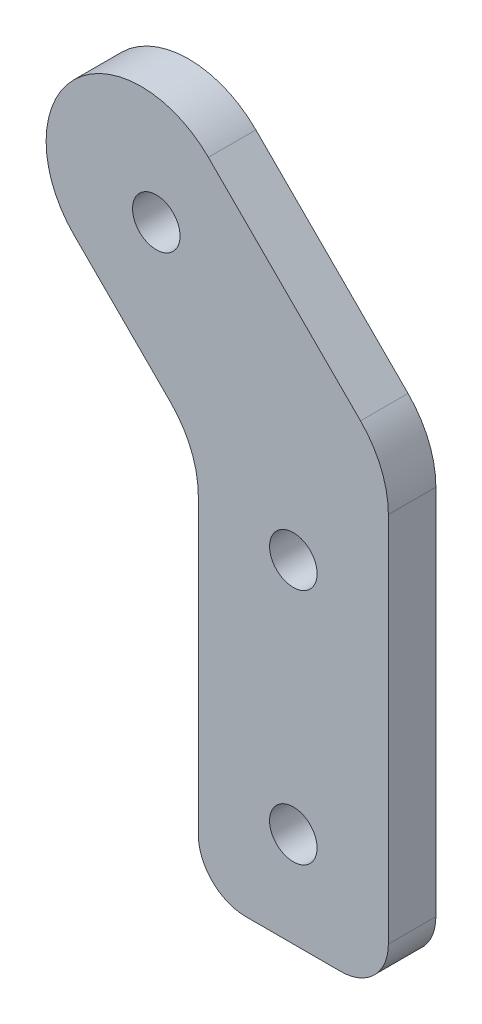
ISO-10303-21;
HEADER;
FILE_DESCRIPTION(('STEP AP214'),'2;1');
FILE_NAME('part.step','',(''),(''),'','','');
FILE_SCHEMA(('AUTOMOTIVE_DESIGN { 1 0 10303 214 1 1 1 1 }'));
ENDSEC;
DATA;
#1=APPLICATION_CONTEXT('core data for automotive mechanical design processes');
#2=APPLICATION_PROTOCOL_DEFINITION('international standard','automotive_design',2000,#1);
#3=PRODUCT_CONTEXT('',#1,'mechanical');
#4=PRODUCT('Part','Part','',(#3));
#5=PRODUCT_RELATED_PRODUCT_CATEGORY('part','',(#4));
#6=PRODUCT_DEFINITION_FORMATION('','',#4);
#7=PRODUCT_DEFINITION_CONTEXT('part definition',#1,'design');
#8=PRODUCT_DEFINITION('design','',#6,#7);
#9=PRODUCT_DEFINITION_SHAPE('','',#8);
#10=(LENGTH_UNIT() NAMED_UNIT(*) SI_UNIT(.MILLI.,.METRE.));
#11=(NAMED_UNIT(*) PLANE_ANGLE_UNIT() SI_UNIT($,.RADIAN.));
#12=(NAMED_UNIT(*) SI_UNIT($,.STERADIAN.) SOLID_ANGLE_UNIT());
#13=UNCERTAINTY_MEASURE_WITH_UNIT(LENGTH_MEASURE(1.E-05),#10,'distance_accuracy_value','');
#14=(GEOMETRIC_REPRESENTATION_CONTEXT(3) GLOBAL_UNCERTAINTY_ASSIGNED_CONTEXT((#13)) GLOBAL_UNIT_ASSIGNED_CONTEXT((#10,
#11,#12)) REPRESENTATION_CONTEXT('',''));
#15=CARTESIAN_POINT('',(0.,0.,0.));
#16=DIRECTION('',(0.,0.,1.));
#17=DIRECTION('',(1.,0.,0.));
#18=AXIS2_PLACEMENT_3D('',#15,#16,#17);
#19=CARTESIAN_POINT('',(0.,0.,5.));
#20=DIRECTION('',(0.,0.,-1.));
#21=DIRECTION('',(-1.,0.,0.));
#22=AXIS2_PLACEMENT_3D('',#19,#20,#21);
#23=PLANE('',#22);
#24=DIRECTION('',(1.,0.,0.));
#25=VECTOR('',#24,1.);
#26=CARTESIAN_POINT('',(20.,0.,5.));
#27=LINE('',#26,#25);
#28=CARTESIAN_POINT('',(5.,0.,5.));
#29=VERTEX_POINT('',#28);
#30=CARTESIAN_POINT('',(15.,0.,5.));
#31=VERTEX_POINT('',#30);
#32=EDGE_CURVE('E169',#29,#31,#27,.T.);
#33=ORIENTED_EDGE('',*,*,#32,.T.);
#34=CARTESIAN_POINT('',(15.,5.,5.));
#35=DIRECTION('',(0.,0.,-1.));
#36=DIRECTION('',(-1.,0.,0.));
#37=AXIS2_PLACEMENT_3D('',#34,#35,#36);
#38=CIRCLE('',#37,5.);
#39=CARTESIAN_POINT('',(20.,5.,5.));
#40=VERTEX_POINT('',#39);
#41=EDGE_CURVE('E48',#31,#40,#38,.F.);
#42=ORIENTED_EDGE('',*,*,#41,.T.);
#43=DIRECTION('',(0.,1.,0.));
#44=VECTOR('',#43,1.);
#45=CARTESIAN_POINT('',(20.,48.2842712474619,5.));
#46=LINE('',#45,#44);
#47=CARTESIAN_POINT('',(20.,44.1421356237309,5.));
#48=VERTEX_POINT('',#47);
#49=EDGE_CURVE('E233',#40,#48,#46,.T.);
#50=ORIENTED_EDGE('',*,*,#49,.T.);
#51=CARTESIAN_POINT('',(10.,44.1421356237309,5.));
#52=DIRECTION('',(0.,0.,-1.));
#53=DIRECTION('',(-1.,0.,0.));
#54=AXIS2_PLACEMENT_3D('',#51,#52,#53);
#55=CIRCLE('',#54,10.);
#56=CARTESIAN_POINT('',(17.0710678118655,51.2132034355964,5.));
#57=VERTEX_POINT('',#56);
#58=EDGE_CURVE('E185',#48,#57,#55,.F.);
#59=ORIENTED_EDGE('',*,*,#58,.T.);
#60=DIRECTION('',(-0.707106781186546,0.707106781186549,0.));
#61=VECTOR('',#60,1.);
#62=CARTESIAN_POINT('',(-6.01080477724779,74.2950760247098,5.));
#63=LINE('',#62,#61);
#64=CARTESIAN_POINT('',(1.06026303461767,67.2240082128443,5.));
#65=VERTEX_POINT('',#64);
#66=EDGE_CURVE('E146',#57,#65,#63,.T.);
#67=ORIENTED_EDGE('',*,*,#66,.T.);
#68=CARTESIAN_POINT('',(-6.01080477724782,60.1529404009788,5.));
#69=DIRECTION('',(0.,0.,-1.));
#70=DIRECTION('',(-1.,0.,0.));
#71=AXIS2_PLACEMENT_3D('',#68,#69,#70);
#72=CIRCLE('',#71,10.);
#73=CARTESIAN_POINT('',(-13.0818725891133,67.2240082128443,5.));
#74=VERTEX_POINT('',#73);
#75=EDGE_CURVE('E179',#65,#74,#72,.F.);
#76=ORIENTED_EDGE('',*,*,#75,.T.);
#77=CARTESIAN_POINT('',(-6.01080477724782,60.1529404009788,5.));
#78=DIRECTION('',(0.,0.,-1.));
#79=DIRECTION('',(-1.,0.,0.));
#80=AXIS2_PLACEMENT_3D('',#77,#78,#79);
#81=CIRCLE('',#80,10.);
#82=CARTESIAN_POINT('',(-13.0818725891133,53.0818725891134,5.));
#83=VERTEX_POINT('',#82);
#84=EDGE_CURVE('E182',#74,#83,#81,.F.);
#85=ORIENTED_EDGE('',*,*,#84,.T.);
#86=DIRECTION('',(0.707106781186546,-0.707106781186549,0.));
#87=VECTOR('',#86,1.);
#88=CARTESIAN_POINT('',(0.,40.,5.));
#89=LINE('',#88,#87);
#90=CARTESIAN_POINT('',(-2.92893218813451,42.9289321881345,5.));
#91=VERTEX_POINT('',#90);
#92=EDGE_CURVE('E253',#83,#91,#89,.T.);
#93=ORIENTED_EDGE('',*,*,#92,.T.);
#94=CARTESIAN_POINT('',(-10.,35.8578643762691,5.));
#95=DIRECTION('',(0.,0.,-1.));
#96=DIRECTION('',(-1.,0.,0.));
#97=AXIS2_PLACEMENT_3D('',#94,#95,#96);
#98=CIRCLE('',#97,10.);
#99=CARTESIAN_POINT('',(0.,35.8578643762691,5.));
#100=VERTEX_POINT('',#99);
#101=EDGE_CURVE('E202',#91,#100,#98,.T.);
#102=ORIENTED_EDGE('',*,*,#101,.T.);
#103=DIRECTION('',(0.,-1.,0.));
#104=VECTOR('',#103,1.);
#105=CARTESIAN_POINT('',(0.,0.,5.));
#106=LINE('',#105,#104);
#107=CARTESIAN_POINT('',(0.,5.,5.));
#108=VERTEX_POINT('',#107);
#109=EDGE_CURVE('E171',#100,#108,#106,.T.);
#110=ORIENTED_EDGE('',*,*,#109,.T.);
#111=CARTESIAN_POINT('',(5.,5.,5.));
#112=DIRECTION('',(0.,0.,-1.));
#113=DIRECTION('',(-1.,0.,0.));
#114=AXIS2_PLACEMENT_3D('',#111,#112,#113);
#115=CIRCLE('',#114,5.);
#116=EDGE_CURVE('E226',#108,#29,#115,.F.);
#117=ORIENTED_EDGE('',*,*,#116,.T.);
#118=EDGE_LOOP('',(#33,#42,#50,#59,#67,#76,#85,#93,#102,#110,#117));
#119=FACE_BOUND('',#118,.T.);
#120=CARTESIAN_POINT('',(10.,10.,5.));
#121=DIRECTION('',(0.,0.,1.));
#122=DIRECTION('',(1.,0.,0.));
#123=AXIS2_PLACEMENT_3D('',#120,#121,#122);
#124=CIRCLE('',#123,2.5);
#125=CARTESIAN_POINT('',(12.5,10.,5.));
#126=VERTEX_POINT('',#125);
#127=EDGE_CURVE('E245',#126,#126,#124,.T.);
#128=ORIENTED_EDGE('',*,*,#127,.F.);
#129=EDGE_LOOP('',(#128));
#130=FACE_BOUND('',#129,.T.);
#131=CARTESIAN_POINT('',(9.99999999999999,35.,5.));
#132=DIRECTION('',(0.,0.,1.));
#133=DIRECTION('',(1.,0.,0.));
#134=AXIS2_PLACEMENT_3D('',#131,#132,#133);
#135=CIRCLE('',#134,2.5);
#136=CARTESIAN_POINT('',(12.5,35.,5.));
#137=VERTEX_POINT('',#136);
#138=EDGE_CURVE('E263',#137,#137,#135,.T.);
#139=ORIENTED_EDGE('',*,*,#138,.F.);
#140=EDGE_LOOP('',(#139));
#141=FACE_BOUND('',#140,.T.);
#142=CARTESIAN_POINT('',(-4.41957066525225,58.5617062889833,5.));
#143=DIRECTION('',(0.,0.,1.));
#144=DIRECTION('',(1.,0.,0.));
#145=AXIS2_PLACEMENT_3D('',#142,#143,#144);
#146=CIRCLE('',#145,2.5);
#147=CARTESIAN_POINT('',(-1.91957066525225,58.5617062889833,5.));
#148=VERTEX_POINT('',#147);
#149=EDGE_CURVE('E269',#148,#148,#146,.T.);
#150=ORIENTED_EDGE('',*,*,#149,.F.);
#151=EDGE_LOOP('',(#150));
#152=FACE_BOUND('',#151,.T.);
#153=ADVANCED_FACE('F39',(#119,#130,#141,#152),#23,.F.);
#154=CARTESIAN_POINT('',(0.,0.,0.));
#155=DIRECTION('',(0.,0.,-1.));
#156=DIRECTION('',(-1.,0.,0.));
#157=AXIS2_PLACEMENT_3D('',#154,#155,#156);
#158=PLANE('',#157);
#159=CARTESIAN_POINT('',(9.99999999999999,35.,0.));
#160=DIRECTION('',(0.,0.,1.));
#161=DIRECTION('',(1.,0.,0.));
#162=AXIS2_PLACEMENT_3D('',#159,#160,#161);
#163=CIRCLE('',#162,2.5);
#164=CARTESIAN_POINT('',(12.5,35.,0.));
#165=VERTEX_POINT('',#164);
#166=EDGE_CURVE('E265',#165,#165,#163,.T.);
#167=ORIENTED_EDGE('',*,*,#166,.T.);
#168=EDGE_LOOP('',(#167));
#169=FACE_BOUND('',#168,.T.);
#170=DIRECTION('',(0.,1.,0.));
#171=VECTOR('',#170,1.);
#172=CARTESIAN_POINT('',(20.,48.2842712474619,0.));
#173=LINE('',#172,#171);
#174=CARTESIAN_POINT('',(20.,5.,0.));
#175=VERTEX_POINT('',#174);
#176=CARTESIAN_POINT('',(20.,44.1421356237309,0.));
#177=VERTEX_POINT('',#176);
#178=EDGE_CURVE('E156',#175,#177,#173,.T.);
#179=ORIENTED_EDGE('',*,*,#178,.F.);
#180=CARTESIAN_POINT('',(15.,5.,0.));
#181=DIRECTION('',(0.,0.,-1.));
#182=DIRECTION('',(-1.,0.,0.));
#183=AXIS2_PLACEMENT_3D('',#180,#181,#182);
#184=CIRCLE('',#183,5.);
#185=CARTESIAN_POINT('',(15.,0.,0.));
#186=VERTEX_POINT('',#185);
#187=EDGE_CURVE('E217',#175,#186,#184,.T.);
#188=ORIENTED_EDGE('',*,*,#187,.T.);
#189=DIRECTION('',(1.,0.,0.));
#190=VECTOR('',#189,1.);
#191=CARTESIAN_POINT('',(20.,0.,0.));
#192=LINE('',#191,#190);
#193=CARTESIAN_POINT('',(5.,0.,0.));
#194=VERTEX_POINT('',#193);
#195=EDGE_CURVE('E163',#194,#186,#192,.T.);
#196=ORIENTED_EDGE('',*,*,#195,.F.);
#197=CARTESIAN_POINT('',(5.,5.,0.));
#198=DIRECTION('',(0.,0.,-1.));
#199=DIRECTION('',(-1.,0.,0.));
#200=AXIS2_PLACEMENT_3D('',#197,#198,#199);
#201=CIRCLE('',#200,5.);
#202=CARTESIAN_POINT('',(0.,5.,0.));
#203=VERTEX_POINT('',#202);
#204=EDGE_CURVE('E214',#194,#203,#201,.T.);
#205=ORIENTED_EDGE('',*,*,#204,.T.);
#206=DIRECTION('',(0.,-1.,0.));
#207=VECTOR('',#206,1.);
#208=CARTESIAN_POINT('',(0.,0.,0.));
#209=LINE('',#208,#207);
#210=CARTESIAN_POINT('',(0.,35.8578643762691,0.));
#211=VERTEX_POINT('',#210);
#212=EDGE_CURVE('E161',#211,#203,#209,.T.);
#213=ORIENTED_EDGE('',*,*,#212,.F.);
#214=CARTESIAN_POINT('',(-10.,35.8578643762691,0.));
#215=DIRECTION('',(0.,0.,-1.));
#216=DIRECTION('',(-1.,0.,0.));
#217=AXIS2_PLACEMENT_3D('',#214,#215,#216);
#218=CIRCLE('',#217,10.);
#219=CARTESIAN_POINT('',(-2.92893218813451,42.9289321881345,0.));
#220=VERTEX_POINT('',#219);
#221=EDGE_CURVE('E199',#211,#220,#218,.F.);
#222=ORIENTED_EDGE('',*,*,#221,.T.);
#223=DIRECTION('',(0.707106781186546,-0.707106781186549,0.));
#224=VECTOR('',#223,1.);
#225=CARTESIAN_POINT('',(0.,40.,0.));
#226=LINE('',#225,#224);
#227=CARTESIAN_POINT('',(-13.0818725891133,53.0818725891134,0.));
#228=VERTEX_POINT('',#227);
#229=EDGE_CURVE('E155',#228,#220,#226,.T.);
#230=ORIENTED_EDGE('',*,*,#229,.F.);
#231=CARTESIAN_POINT('',(-6.01080477724782,60.1529404009788,0.));
#232=DIRECTION('',(0.,0.,-1.));
#233=DIRECTION('',(-1.,0.,0.));
#234=AXIS2_PLACEMENT_3D('',#231,#232,#233);
#235=CIRCLE('',#234,10.);
#236=CARTESIAN_POINT('',(-13.0818725891133,67.2240082128443,0.));
#237=VERTEX_POINT('',#236);
#238=EDGE_CURVE('E137',#228,#237,#235,.T.);
#239=ORIENTED_EDGE('',*,*,#238,.T.);
#240=CARTESIAN_POINT('',(-6.01080477724782,60.1529404009788,0.));
#241=DIRECTION('',(0.,0.,-1.));
#242=DIRECTION('',(-1.,0.,0.));
#243=AXIS2_PLACEMENT_3D('',#240,#241,#242);
#244=CIRCLE('',#243,10.);
#245=CARTESIAN_POINT('',(1.06026303461767,67.2240082128443,0.));
#246=VERTEX_POINT('',#245);
#247=EDGE_CURVE('E148',#237,#246,#244,.T.);
#248=ORIENTED_EDGE('',*,*,#247,.T.);
#249=DIRECTION('',(-0.707106781186546,0.707106781186549,0.));
#250=VECTOR('',#249,1.);
#251=CARTESIAN_POINT('',(-6.01080477724779,74.2950760247098,0.));
#252=LINE('',#251,#250);
#253=CARTESIAN_POINT('',(17.0710678118655,51.2132034355964,0.));
#254=VERTEX_POINT('',#253);
#255=EDGE_CURVE('E143',#254,#246,#252,.T.);
#256=ORIENTED_EDGE('',*,*,#255,.F.);
#257=CARTESIAN_POINT('',(10.,44.1421356237309,0.));
#258=DIRECTION('',(0.,0.,-1.));
#259=DIRECTION('',(-1.,0.,0.));
#260=AXIS2_PLACEMENT_3D('',#257,#258,#259);
#261=CIRCLE('',#260,10.);
#262=EDGE_CURVE('E126',#254,#177,#261,.T.);
#263=ORIENTED_EDGE('',*,*,#262,.T.);
#264=EDGE_LOOP('',(#179,#188,#196,#205,#213,#222,#230,#239,#248,#256,#263));
#265=FACE_BOUND('',#264,.T.);
#266=CARTESIAN_POINT('',(10.,10.,0.));
#267=DIRECTION('',(0.,0.,1.));
#268=DIRECTION('',(1.,0.,0.));
#269=AXIS2_PLACEMENT_3D('',#266,#267,#268);
#270=CIRCLE('',#269,2.5);
#271=CARTESIAN_POINT('',(12.5,10.,0.));
#272=VERTEX_POINT('',#271);
#273=EDGE_CURVE('E248',#272,#272,#270,.T.);
#274=ORIENTED_EDGE('',*,*,#273,.T.);
#275=EDGE_LOOP('',(#274));
#276=FACE_BOUND('',#275,.T.);
#277=CARTESIAN_POINT('',(-4.41957066525225,58.5617062889833,0.));
#278=DIRECTION('',(0.,0.,1.));
#279=DIRECTION('',(1.,0.,0.));
#280=AXIS2_PLACEMENT_3D('',#277,#278,#279);
#281=CIRCLE('',#280,2.5);
#282=CARTESIAN_POINT('',(-1.91957066525225,58.5617062889833,0.));
#283=VERTEX_POINT('',#282);
#284=EDGE_CURVE('E210',#283,#283,#281,.T.);
#285=ORIENTED_EDGE('',*,*,#284,.T.);
#286=EDGE_LOOP('',(#285));
#287=FACE_BOUND('',#286,.T.);
#288=ADVANCED_FACE('F151',(#169,#265,#276,#287),#158,.T.);
#289=CARTESIAN_POINT('',(20.,0.,5.));
#290=DIRECTION('',(0.,1.,0.));
#291=DIRECTION('',(0.,0.,1.));
#292=AXIS2_PLACEMENT_3D('',#289,#290,#291);
#293=PLANE('',#292);
#294=ORIENTED_EDGE('',*,*,#195,.T.);
#295=DIRECTION('',(0.,0.,-1.));
#296=VECTOR('',#295,1.);
#297=CARTESIAN_POINT('',(15.,0.,5.));
#298=LINE('',#297,#296);
#299=EDGE_CURVE('E61',#186,#31,#298,.F.);
#300=ORIENTED_EDGE('',*,*,#299,.T.);
#301=ORIENTED_EDGE('',*,*,#32,.F.);
#302=DIRECTION('',(0.,0.,-1.));
#303=VECTOR('',#302,1.);
#304=CARTESIAN_POINT('',(5.,0.,5.));
#305=LINE('',#304,#303);
#306=EDGE_CURVE('E220',#29,#194,#305,.T.);
#307=ORIENTED_EDGE('',*,*,#306,.T.);
#308=EDGE_LOOP('',(#294,#300,#301,#307));
#309=FACE_BOUND('',#308,.T.);
#310=ADVANCED_FACE('F242',(#309),#293,.F.);
#311=CARTESIAN_POINT('',(20.,48.2842712474619,5.));
#312=DIRECTION('',(-1.,0.,0.));
#313=DIRECTION('',(0.,-1.,0.));
#314=AXIS2_PLACEMENT_3D('',#311,#312,#313);
#315=PLANE('',#314);
#316=ORIENTED_EDGE('',*,*,#49,.F.);
#317=DIRECTION('',(0.,0.,-1.));
#318=VECTOR('',#317,1.);
#319=CARTESIAN_POINT('',(20.,5.,5.));
#320=LINE('',#319,#318);
#321=EDGE_CURVE('E205',#40,#175,#320,.T.);
#322=ORIENTED_EDGE('',*,*,#321,.T.);
#323=ORIENTED_EDGE('',*,*,#178,.T.);
#324=DIRECTION('',(0.,0.,-1.));
#325=VECTOR('',#324,1.);
#326=CARTESIAN_POINT('',(20.,44.1421356237309,5.));
#327=LINE('',#326,#325);
#328=EDGE_CURVE('E132',#177,#48,#327,.F.);
#329=ORIENTED_EDGE('',*,*,#328,.T.);
#330=EDGE_LOOP('',(#316,#322,#323,#329));
#331=FACE_BOUND('',#330,.T.);
#332=ADVANCED_FACE('F237',(#331),#315,.F.);
#333=CARTESIAN_POINT('',(-6.01080477724779,74.2950760247098,5.));
#334=DIRECTION('',(-0.707106781186549,-0.707106781186546,0.));
#335=DIRECTION('',(0.707106781186546,-0.707106781186549,0.));
#336=AXIS2_PLACEMENT_3D('',#333,#334,#335);
#337=PLANE('',#336);
#338=ORIENTED_EDGE('',*,*,#66,.F.);
#339=DIRECTION('',(0.,0.,-1.));
#340=VECTOR('',#339,1.);
#341=CARTESIAN_POINT('',(17.0710678118655,51.2132034355964,5.));
#342=LINE('',#341,#340);
#343=EDGE_CURVE('E130',#57,#254,#342,.T.);
#344=ORIENTED_EDGE('',*,*,#343,.T.);
#345=ORIENTED_EDGE('',*,*,#255,.T.);
#346=DIRECTION('',(0.,0.,-1.));
#347=VECTOR('',#346,1.);
#348=CARTESIAN_POINT('',(1.06026303461767,67.2240082128443,5.));
#349=LINE('',#348,#347);
#350=EDGE_CURVE('E149',#246,#65,#349,.F.);
#351=ORIENTED_EDGE('',*,*,#350,.T.);
#352=EDGE_LOOP('',(#338,#344,#345,#351));
#353=FACE_BOUND('',#352,.T.);
#354=ADVANCED_FACE('F142',(#353),#337,.F.);
#355=CARTESIAN_POINT('',(0.,40.,5.));
#356=DIRECTION('',(0.707106781186549,0.707106781186546,0.));
#357=DIRECTION('',(-0.707106781186546,0.707106781186549,0.));
#358=AXIS2_PLACEMENT_3D('',#355,#356,#357);
#359=PLANE('',#358);
#360=ORIENTED_EDGE('',*,*,#229,.T.);
#361=DIRECTION('',(0.,0.,-1.));
#362=VECTOR('',#361,1.);
#363=CARTESIAN_POINT('',(-2.92893218813451,42.9289321881345,5.));
#364=LINE('',#363,#362);
#365=EDGE_CURVE('E196',#220,#91,#364,.F.);
#366=ORIENTED_EDGE('',*,*,#365,.T.);
#367=ORIENTED_EDGE('',*,*,#92,.F.);
#368=DIRECTION('',(0.,0.,-1.));
#369=VECTOR('',#368,1.);
#370=CARTESIAN_POINT('',(-13.0818725891133,53.0818725891134,5.));
#371=LINE('',#370,#369);
#372=EDGE_CURVE('E192',#83,#228,#371,.T.);
#373=ORIENTED_EDGE('',*,*,#372,.T.);
#374=EDGE_LOOP('',(#360,#366,#367,#373));
#375=FACE_BOUND('',#374,.T.);
#376=ADVANCED_FACE('F297',(#375),#359,.F.);
#377=CARTESIAN_POINT('',(0.,0.,5.));
#378=DIRECTION('',(1.,0.,0.));
#379=DIRECTION('',(0.,0.,-1.));
#380=AXIS2_PLACEMENT_3D('',#377,#378,#379);
#381=PLANE('',#380);
#382=ORIENTED_EDGE('',*,*,#212,.T.);
#383=DIRECTION('',(0.,0.,-1.));
#384=VECTOR('',#383,1.);
#385=CARTESIAN_POINT('',(0.,5.,5.));
#386=LINE('',#385,#384);
#387=EDGE_CURVE('E11',#203,#108,#386,.F.);
#388=ORIENTED_EDGE('',*,*,#387,.T.);
#389=ORIENTED_EDGE('',*,*,#109,.F.);
#390=DIRECTION('',(0.,0.,-1.));
#391=VECTOR('',#390,1.);
#392=CARTESIAN_POINT('',(0.,35.8578643762691,0.));
#393=LINE('',#392,#391);
#394=EDGE_CURVE('E188',#100,#211,#393,.T.);
#395=ORIENTED_EDGE('',*,*,#394,.T.);
#396=EDGE_LOOP('',(#382,#388,#389,#395));
#397=FACE_BOUND('',#396,.T.);
#398=ADVANCED_FACE('F294',(#397),#381,.F.);
#399=CARTESIAN_POINT('',(10.,10.,5.));
#400=DIRECTION('',(0.,0.,-1.));
#401=DIRECTION('',(-1.,0.,0.));
#402=AXIS2_PLACEMENT_3D('',#399,#400,#401);
#403=CYLINDRICAL_SURFACE('',#402,2.5);
#404=ORIENTED_EDGE('',*,*,#127,.T.);
#405=EDGE_LOOP('',(#404));
#406=FACE_BOUND('',#405,.T.);
#407=ORIENTED_EDGE('',*,*,#273,.F.);
#408=EDGE_LOOP('',(#407));
#409=FACE_BOUND('',#408,.T.);
#410=ADVANCED_FACE('F291',(#406,#409),#403,.F.);
#411=CARTESIAN_POINT('',(9.99999999999999,35.,5.));
#412=DIRECTION('',(0.,0.,-1.));
#413=DIRECTION('',(-1.,0.,0.));
#414=AXIS2_PLACEMENT_3D('',#411,#412,#413);
#415=CYLINDRICAL_SURFACE('',#414,2.5);
#416=ORIENTED_EDGE('',*,*,#138,.T.);
#417=EDGE_LOOP('',(#416));
#418=FACE_BOUND('',#417,.T.);
#419=ORIENTED_EDGE('',*,*,#166,.F.);
#420=EDGE_LOOP('',(#419));
#421=FACE_BOUND('',#420,.T.);
#422=ADVANCED_FACE('F417',(#418,#421),#415,.F.);
#423=CARTESIAN_POINT('',(-4.41957066525225,58.5617062889833,5.));
#424=DIRECTION('',(0.,0.,-1.));
#425=DIRECTION('',(-1.,0.,0.));
#426=AXIS2_PLACEMENT_3D('',#423,#424,#425);
#427=CYLINDRICAL_SURFACE('',#426,2.5);
#428=ORIENTED_EDGE('',*,*,#149,.T.);
#429=EDGE_LOOP('',(#428));
#430=FACE_BOUND('',#429,.T.);
#431=ORIENTED_EDGE('',*,*,#284,.F.);
#432=EDGE_LOOP('',(#431));
#433=FACE_BOUND('',#432,.T.);
#434=ADVANCED_FACE('F280',(#430,#433),#427,.F.);
#435=CARTESIAN_POINT('',(10.,44.1421356237309,5.));
#436=DIRECTION('',(0.,0.,-1.));
#437=DIRECTION('',(-1.,0.,0.));
#438=AXIS2_PLACEMENT_3D('',#435,#436,#437);
#439=CYLINDRICAL_SURFACE('',#438,10.);
#440=ORIENTED_EDGE('',*,*,#58,.F.);
#441=ORIENTED_EDGE('',*,*,#328,.F.);
#442=ORIENTED_EDGE('',*,*,#262,.F.);
#443=ORIENTED_EDGE('',*,*,#343,.F.);
#444=EDGE_LOOP('',(#440,#441,#442,#443));
#445=FACE_BOUND('',#444,.T.);
#446=ADVANCED_FACE('F129',(#445),#439,.T.);
#447=CARTESIAN_POINT('',(-10.,35.8578643762691,5.));
#448=DIRECTION('',(0.,0.,1.));
#449=DIRECTION('',(1.,0.,0.));
#450=AXIS2_PLACEMENT_3D('',#447,#448,#449);
#451=CYLINDRICAL_SURFACE('',#450,10.);
#452=ORIENTED_EDGE('',*,*,#101,.F.);
#453=ORIENTED_EDGE('',*,*,#365,.F.);
#454=ORIENTED_EDGE('',*,*,#221,.F.);
#455=ORIENTED_EDGE('',*,*,#394,.F.);
#456=EDGE_LOOP('',(#452,#453,#454,#455));
#457=FACE_BOUND('',#456,.T.);
#458=ADVANCED_FACE('F309',(#457),#451,.F.);
#459=CARTESIAN_POINT('',(-6.01080477724782,60.1529404009788,5.));
#460=DIRECTION('',(0.,0.,-1.));
#461=DIRECTION('',(-1.,0.,0.));
#462=AXIS2_PLACEMENT_3D('',#459,#460,#461);
#463=CYLINDRICAL_SURFACE('',#462,10.);
#464=DIRECTION('',(0.,0.,-1.));
#465=VECTOR('',#464,1.);
#466=CARTESIAN_POINT('',(-13.0818725891133,67.2240082128443,5.));
#467=LINE('',#466,#465);
#468=EDGE_CURVE('E206',#74,#237,#467,.T.);
#469=ORIENTED_EDGE('',*,*,#468,.F.);
#470=ORIENTED_EDGE('',*,*,#75,.F.);
#471=ORIENTED_EDGE('',*,*,#350,.F.);
#472=ORIENTED_EDGE('',*,*,#247,.F.);
#473=EDGE_LOOP('',(#469,#470,#471,#472));
#474=FACE_BOUND('',#473,.T.);
#475=ADVANCED_FACE('F312',(#474),#463,.T.);
#476=CARTESIAN_POINT('',(-6.01080477724782,60.1529404009788,5.));
#477=DIRECTION('',(0.,0.,-1.));
#478=DIRECTION('',(-1.,0.,0.));
#479=AXIS2_PLACEMENT_3D('',#476,#477,#478);
#480=CYLINDRICAL_SURFACE('',#479,10.);
#481=ORIENTED_EDGE('',*,*,#84,.F.);
#482=ORIENTED_EDGE('',*,*,#468,.T.);
#483=ORIENTED_EDGE('',*,*,#238,.F.);
#484=ORIENTED_EDGE('',*,*,#372,.F.);
#485=EDGE_LOOP('',(#481,#482,#483,#484));
#486=FACE_BOUND('',#485,.T.);
#487=ADVANCED_FACE('F314',(#486),#480,.T.);
#488=CARTESIAN_POINT('',(15.,5.,5.));
#489=DIRECTION('',(0.,0.,-1.));
#490=DIRECTION('',(-1.,0.,0.));
#491=AXIS2_PLACEMENT_3D('',#488,#489,#490);
#492=CYLINDRICAL_SURFACE('',#491,5.);
#493=ORIENTED_EDGE('',*,*,#41,.F.);
#494=ORIENTED_EDGE('',*,*,#299,.F.);
#495=ORIENTED_EDGE('',*,*,#187,.F.);
#496=ORIENTED_EDGE('',*,*,#321,.F.);
#497=EDGE_LOOP('',(#493,#494,#495,#496));
#498=FACE_BOUND('',#497,.T.);
#499=ADVANCED_FACE('F240',(#498),#492,.T.);
#500=CARTESIAN_POINT('',(5.,5.,5.));
#501=DIRECTION('',(0.,0.,-1.));
#502=DIRECTION('',(-1.,0.,0.));
#503=AXIS2_PLACEMENT_3D('',#500,#501,#502);
#504=CYLINDRICAL_SURFACE('',#503,5.);
#505=ORIENTED_EDGE('',*,*,#116,.F.);
#506=ORIENTED_EDGE('',*,*,#387,.F.);
#507=ORIENTED_EDGE('',*,*,#204,.F.);
#508=ORIENTED_EDGE('',*,*,#306,.F.);
#509=EDGE_LOOP('',(#505,#506,#507,#508));
#510=FACE_BOUND('',#509,.T.);
#511=ADVANCED_FACE('F41',(#510),#504,.T.);
#512=CLOSED_SHELL('',(#153,#288,#310,#332,#354,#376,#398,#410,#422,#434,#446,#458,#475,#487,
#499,#511));
#513=MANIFOLD_SOLID_BREP('B2',#512);
#514=ADVANCED_BREP_SHAPE_REPRESENTATION('',(#18,#513),#14);
#515=SHAPE_DEFINITION_REPRESENTATION(#9,#514);
ENDSEC;
END-ISO-10303-21;
